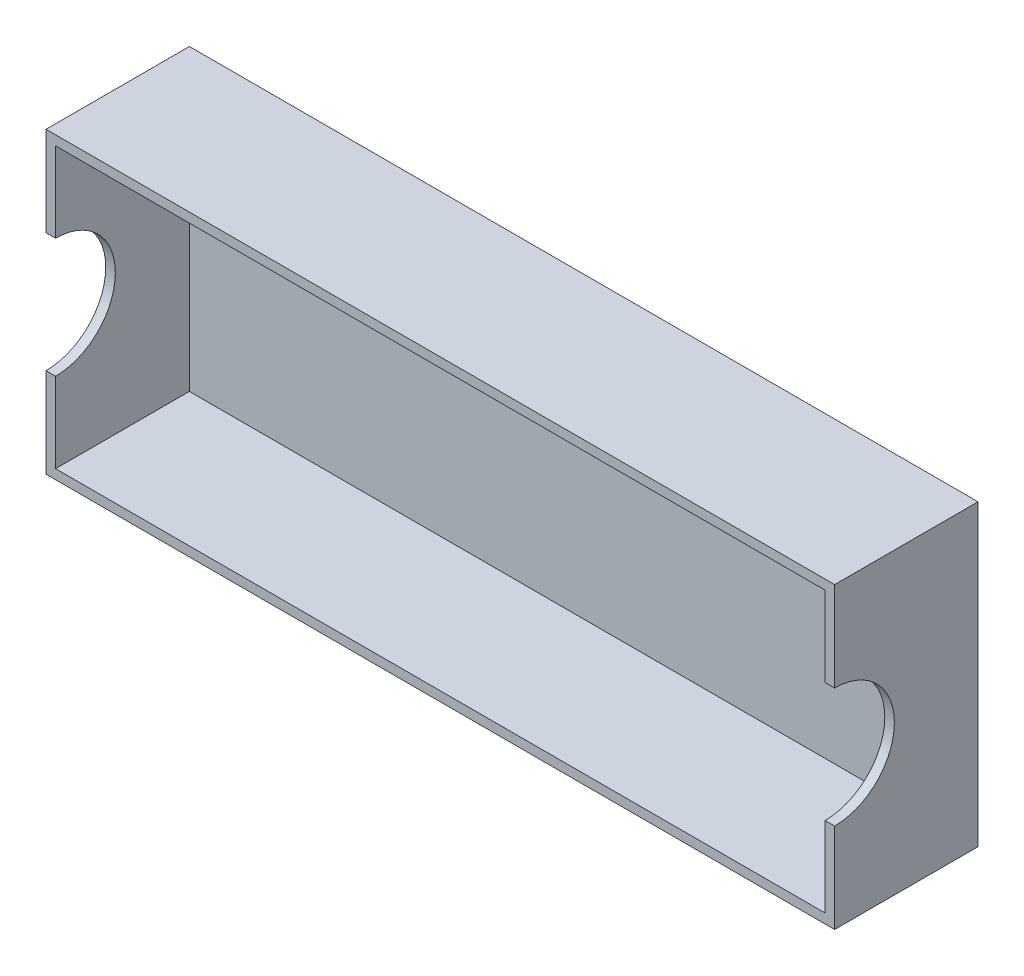
ISO-10303-21;
HEADER;
FILE_DESCRIPTION(('STEP AP214'),'2;1');
FILE_NAME('part.step','',(''),(''),'','','');
FILE_SCHEMA(('AUTOMOTIVE_DESIGN { 1 0 10303 214 1 1 1 1 }'));
ENDSEC;
DATA;
#1=APPLICATION_CONTEXT('core data for automotive mechanical design processes');
#2=APPLICATION_PROTOCOL_DEFINITION('international standard','automotive_design',2000,#1);
#3=PRODUCT_CONTEXT('',#1,'mechanical');
#4=PRODUCT('Part','Part','',(#3));
#5=PRODUCT_RELATED_PRODUCT_CATEGORY('part','',(#4));
#6=PRODUCT_DEFINITION_FORMATION('','',#4);
#7=PRODUCT_DEFINITION_CONTEXT('part definition',#1,'design');
#8=PRODUCT_DEFINITION('design','',#6,#7);
#9=PRODUCT_DEFINITION_SHAPE('','',#8);
#10=(LENGTH_UNIT() NAMED_UNIT(*) SI_UNIT(.MILLI.,.METRE.));
#11=(NAMED_UNIT(*) PLANE_ANGLE_UNIT() SI_UNIT($,.RADIAN.));
#12=(NAMED_UNIT(*) SI_UNIT($,.STERADIAN.) SOLID_ANGLE_UNIT());
#13=UNCERTAINTY_MEASURE_WITH_UNIT(LENGTH_MEASURE(1.E-05),#10,'distance_accuracy_value','');
#14=(GEOMETRIC_REPRESENTATION_CONTEXT(3) GLOBAL_UNCERTAINTY_ASSIGNED_CONTEXT((#13)) GLOBAL_UNIT_ASSIGNED_CONTEXT((#10,
#11,#12)) REPRESENTATION_CONTEXT('',''));
#15=CARTESIAN_POINT('',(0.,0.,0.));
#16=DIRECTION('',(0.,0.,1.));
#17=DIRECTION('',(1.,0.,0.));
#18=AXIS2_PLACEMENT_3D('',#15,#16,#17);
#19=CARTESIAN_POINT('',(0.,0.,12.));
#20=DIRECTION('',(0.,0.,1.));
#21=DIRECTION('',(1.,0.,0.));
#22=AXIS2_PLACEMENT_3D('',#19,#20,#21);
#23=PLANE('',#22);
#24=DIRECTION('',(1.,0.,0.));
#25=VECTOR('',#24,1.);
#26=CARTESIAN_POINT('',(-33.,-5.,12.));
#27=LINE('',#26,#25);
#28=CARTESIAN_POINT('',(-33.,-5.,12.));
#29=VERTEX_POINT('',#28);
#30=CARTESIAN_POINT('',(-32.2,-5.,12.));
#31=VERTEX_POINT('',#30);
#32=EDGE_CURVE('E56',#29,#31,#27,.T.);
#33=ORIENTED_EDGE('',*,*,#32,.F.);
#34=DIRECTION('',(0.,-1.,0.));
#35=VECTOR('',#34,1.);
#36=CARTESIAN_POINT('',(-33.,12.5,12.));
#37=LINE('',#36,#35);
#38=CARTESIAN_POINT('',(-33.,-12.5,12.));
#39=VERTEX_POINT('',#38);
#40=EDGE_CURVE('E135',#29,#39,#37,.T.);
#41=ORIENTED_EDGE('',*,*,#40,.T.);
#42=DIRECTION('',(1.,0.,0.));
#43=VECTOR('',#42,1.);
#44=CARTESIAN_POINT('',(-33.,-12.5,12.));
#45=LINE('',#44,#43);
#46=CARTESIAN_POINT('',(33.,-12.5,12.));
#47=VERTEX_POINT('',#46);
#48=EDGE_CURVE('E142',#39,#47,#45,.T.);
#49=ORIENTED_EDGE('',*,*,#48,.T.);
#50=DIRECTION('',(0.,1.,0.));
#51=VECTOR('',#50,1.);
#52=CARTESIAN_POINT('',(33.,12.5,12.));
#53=LINE('',#52,#51);
#54=CARTESIAN_POINT('',(33.,-5.,12.));
#55=VERTEX_POINT('',#54);
#56=EDGE_CURVE('E185',#47,#55,#53,.T.);
#57=ORIENTED_EDGE('',*,*,#56,.T.);
#58=CARTESIAN_POINT('',(32.2,-5.,12.));
#59=VERTEX_POINT('',#58);
#60=EDGE_CURVE('E191',#59,#55,#27,.T.);
#61=ORIENTED_EDGE('',*,*,#60,.F.);
#62=DIRECTION('',(0.,1.,0.));
#63=VECTOR('',#62,1.);
#64=CARTESIAN_POINT('',(32.2,11.7,12.));
#65=LINE('',#64,#63);
#66=CARTESIAN_POINT('',(32.2,-11.7,12.));
#67=VERTEX_POINT('',#66);
#68=EDGE_CURVE('E195',#67,#59,#65,.T.);
#69=ORIENTED_EDGE('',*,*,#68,.F.);
#70=DIRECTION('',(1.,0.,0.));
#71=VECTOR('',#70,1.);
#72=CARTESIAN_POINT('',(-32.2,-11.7,12.));
#73=LINE('',#72,#71);
#74=CARTESIAN_POINT('',(-32.2,-11.7,12.));
#75=VERTEX_POINT('',#74);
#76=EDGE_CURVE('E212',#75,#67,#73,.T.);
#77=ORIENTED_EDGE('',*,*,#76,.F.);
#78=DIRECTION('',(0.,-1.,0.));
#79=VECTOR('',#78,1.);
#80=CARTESIAN_POINT('',(-32.2,11.7,12.));
#81=LINE('',#80,#79);
#82=EDGE_CURVE('E188',#31,#75,#81,.T.);
#83=ORIENTED_EDGE('',*,*,#82,.F.);
#84=EDGE_LOOP('',(#33,#41,#49,#57,#61,#69,#77,#83));
#85=FACE_BOUND('',#84,.T.);
#86=ADVANCED_FACE('F33',(#85),#23,.T.);
#87=CARTESIAN_POINT('',(33.,12.5,12.));
#88=DIRECTION('',(-1.,0.,0.));
#89=DIRECTION('',(0.,0.,1.));
#90=AXIS2_PLACEMENT_3D('',#87,#88,#89);
#91=PLANE('',#90);
#92=CARTESIAN_POINT('',(33.,5.,12.));
#93=VERTEX_POINT('',#92);
#94=CARTESIAN_POINT('',(33.,12.5,12.));
#95=VERTEX_POINT('',#94);
#96=EDGE_CURVE('E159',#93,#95,#53,.T.);
#97=ORIENTED_EDGE('',*,*,#96,.F.);
#98=CARTESIAN_POINT('',(33.,0.,12.));
#99=DIRECTION('',(1.,0.,0.));
#100=DIRECTION('',(0.,0.,-1.));
#101=AXIS2_PLACEMENT_3D('',#98,#99,#100);
#102=CIRCLE('',#101,5.);
#103=EDGE_CURVE('E136',#55,#93,#102,.T.);
#104=ORIENTED_EDGE('',*,*,#103,.F.);
#105=ORIENTED_EDGE('',*,*,#56,.F.);
#106=DIRECTION('',(0.,0.,-1.));
#107=VECTOR('',#106,1.);
#108=CARTESIAN_POINT('',(33.,-12.5,12.));
#109=LINE('',#108,#107);
#110=CARTESIAN_POINT('',(33.,-12.5,0.));
#111=VERTEX_POINT('',#110);
#112=EDGE_CURVE('E144',#47,#111,#109,.T.);
#113=ORIENTED_EDGE('',*,*,#112,.T.);
#114=DIRECTION('',(0.,1.,0.));
#115=VECTOR('',#114,1.);
#116=CARTESIAN_POINT('',(33.,12.5,0.));
#117=LINE('',#116,#115);
#118=CARTESIAN_POINT('',(33.,12.5,0.));
#119=VERTEX_POINT('',#118);
#120=EDGE_CURVE('E149',#111,#119,#117,.T.);
#121=ORIENTED_EDGE('',*,*,#120,.T.);
#122=DIRECTION('',(0.,0.,-1.));
#123=VECTOR('',#122,1.);
#124=CARTESIAN_POINT('',(33.,12.5,12.));
#125=LINE('',#124,#123);
#126=EDGE_CURVE('E41',#95,#119,#125,.T.);
#127=ORIENTED_EDGE('',*,*,#126,.F.);
#128=EDGE_LOOP('',(#97,#104,#105,#113,#121,#127));
#129=FACE_BOUND('',#128,.T.);
#130=ADVANCED_FACE('F35',(#129),#91,.F.);
#131=CARTESIAN_POINT('',(-33.,12.5,12.));
#132=DIRECTION('',(0.,-1.,0.));
#133=DIRECTION('',(0.,0.,-1.));
#134=AXIS2_PLACEMENT_3D('',#131,#132,#133);
#135=PLANE('',#134);
#136=DIRECTION('',(-1.,0.,0.));
#137=VECTOR('',#136,1.);
#138=CARTESIAN_POINT('',(-33.,12.5,0.));
#139=LINE('',#138,#137);
#140=CARTESIAN_POINT('',(-33.,12.5,0.));
#141=VERTEX_POINT('',#140);
#142=EDGE_CURVE('E152',#119,#141,#139,.T.);
#143=ORIENTED_EDGE('',*,*,#142,.T.);
#144=DIRECTION('',(0.,0.,-1.));
#145=VECTOR('',#144,1.);
#146=CARTESIAN_POINT('',(-33.,12.5,12.));
#147=LINE('',#146,#145);
#148=CARTESIAN_POINT('',(-33.,12.5,12.));
#149=VERTEX_POINT('',#148);
#150=EDGE_CURVE('E165',#149,#141,#147,.T.);
#151=ORIENTED_EDGE('',*,*,#150,.F.);
#152=DIRECTION('',(-1.,0.,0.));
#153=VECTOR('',#152,1.);
#154=CARTESIAN_POINT('',(-33.,12.5,12.));
#155=LINE('',#154,#153);
#156=EDGE_CURVE('E140',#95,#149,#155,.T.);
#157=ORIENTED_EDGE('',*,*,#156,.F.);
#158=ORIENTED_EDGE('',*,*,#126,.T.);
#159=EDGE_LOOP('',(#143,#151,#157,#158));
#160=FACE_BOUND('',#159,.T.);
#161=ADVANCED_FACE('F169',(#160),#135,.F.);
#162=CARTESIAN_POINT('',(-33.,12.5,12.));
#163=DIRECTION('',(1.,0.,0.));
#164=DIRECTION('',(0.,0.,-1.));
#165=AXIS2_PLACEMENT_3D('',#162,#163,#164);
#166=PLANE('',#165);
#167=ORIENTED_EDGE('',*,*,#40,.F.);
#168=CARTESIAN_POINT('',(-33.,0.,12.));
#169=DIRECTION('',(1.,0.,0.));
#170=DIRECTION('',(0.,0.,-1.));
#171=AXIS2_PLACEMENT_3D('',#168,#169,#170);
#172=CIRCLE('',#171,5.);
#173=CARTESIAN_POINT('',(-33.,5.,12.));
#174=VERTEX_POINT('',#173);
#175=EDGE_CURVE('E122',#29,#174,#172,.T.);
#176=ORIENTED_EDGE('',*,*,#175,.T.);
#177=EDGE_CURVE('E133',#149,#174,#37,.T.);
#178=ORIENTED_EDGE('',*,*,#177,.F.);
#179=ORIENTED_EDGE('',*,*,#150,.T.);
#180=DIRECTION('',(0.,-1.,0.));
#181=VECTOR('',#180,1.);
#182=CARTESIAN_POINT('',(-33.,12.5,0.));
#183=LINE('',#182,#181);
#184=CARTESIAN_POINT('',(-33.,-12.5,0.));
#185=VERTEX_POINT('',#184);
#186=EDGE_CURVE('E155',#141,#185,#183,.T.);
#187=ORIENTED_EDGE('',*,*,#186,.T.);
#188=DIRECTION('',(0.,0.,-1.));
#189=VECTOR('',#188,1.);
#190=CARTESIAN_POINT('',(-33.,-12.5,12.));
#191=LINE('',#190,#189);
#192=EDGE_CURVE('E162',#39,#185,#191,.T.);
#193=ORIENTED_EDGE('',*,*,#192,.F.);
#194=EDGE_LOOP('',(#167,#176,#178,#179,#187,#193));
#195=FACE_BOUND('',#194,.T.);
#196=ADVANCED_FACE('F131',(#195),#166,.F.);
#197=CARTESIAN_POINT('',(-33.,-12.5,12.));
#198=DIRECTION('',(0.,1.,0.));
#199=DIRECTION('',(0.,0.,1.));
#200=AXIS2_PLACEMENT_3D('',#197,#198,#199);
#201=PLANE('',#200);
#202=DIRECTION('',(1.,0.,0.));
#203=VECTOR('',#202,1.);
#204=CARTESIAN_POINT('',(-33.,-12.5,0.));
#205=LINE('',#204,#203);
#206=EDGE_CURVE('E157',#185,#111,#205,.T.);
#207=ORIENTED_EDGE('',*,*,#206,.T.);
#208=ORIENTED_EDGE('',*,*,#112,.F.);
#209=ORIENTED_EDGE('',*,*,#48,.F.);
#210=ORIENTED_EDGE('',*,*,#192,.T.);
#211=EDGE_LOOP('',(#207,#208,#209,#210));
#212=FACE_BOUND('',#211,.T.);
#213=ADVANCED_FACE('F181',(#212),#201,.F.);
#214=DIRECTION('',(1.,0.,0.));
#215=VECTOR('',#214,1.);
#216=CARTESIAN_POINT('',(-33.,5.,12.));
#217=LINE('',#216,#215);
#218=CARTESIAN_POINT('',(32.2,5.,12.));
#219=VERTEX_POINT('',#218);
#220=EDGE_CURVE('E48',#93,#219,#217,.F.);
#221=ORIENTED_EDGE('',*,*,#220,.F.);
#222=ORIENTED_EDGE('',*,*,#96,.T.);
#223=ORIENTED_EDGE('',*,*,#156,.T.);
#224=ORIENTED_EDGE('',*,*,#177,.T.);
#225=CARTESIAN_POINT('',(-32.2,5.,12.));
#226=VERTEX_POINT('',#225);
#227=EDGE_CURVE('E119',#226,#174,#217,.F.);
#228=ORIENTED_EDGE('',*,*,#227,.F.);
#229=CARTESIAN_POINT('',(-32.2,11.7,12.));
#230=VERTEX_POINT('',#229);
#231=EDGE_CURVE('E216',#230,#226,#81,.T.);
#232=ORIENTED_EDGE('',*,*,#231,.F.);
#233=DIRECTION('',(-1.,0.,0.));
#234=VECTOR('',#233,1.);
#235=CARTESIAN_POINT('',(-32.2,11.7,12.));
#236=LINE('',#235,#234);
#237=CARTESIAN_POINT('',(32.2,11.7,12.));
#238=VERTEX_POINT('',#237);
#239=EDGE_CURVE('E218',#238,#230,#236,.T.);
#240=ORIENTED_EDGE('',*,*,#239,.F.);
#241=EDGE_CURVE('E193',#219,#238,#65,.T.);
#242=ORIENTED_EDGE('',*,*,#241,.F.);
#243=EDGE_LOOP('',(#221,#222,#223,#224,#228,#232,#240,#242));
#244=FACE_BOUND('',#243,.T.);
#245=ADVANCED_FACE('F138',(#244),#23,.T.);
#246=CARTESIAN_POINT('',(0.,0.,0.));
#247=DIRECTION('',(0.,0.,1.));
#248=DIRECTION('',(1.,0.,0.));
#249=AXIS2_PLACEMENT_3D('',#246,#247,#248);
#250=PLANE('',#249);
#251=ORIENTED_EDGE('',*,*,#120,.F.);
#252=ORIENTED_EDGE('',*,*,#206,.F.);
#253=ORIENTED_EDGE('',*,*,#186,.F.);
#254=ORIENTED_EDGE('',*,*,#142,.F.);
#255=EDGE_LOOP('',(#251,#252,#253,#254));
#256=FACE_BOUND('',#255,.T.);
#257=ADVANCED_FACE('F177',(#256),#250,.F.);
#258=CARTESIAN_POINT('',(32.2,11.7,0.8));
#259=DIRECTION('',(1.,0.,0.));
#260=DIRECTION('',(0.,0.,-1.));
#261=AXIS2_PLACEMENT_3D('',#258,#259,#260);
#262=PLANE('',#261);
#263=ORIENTED_EDGE('',*,*,#68,.T.);
#264=CARTESIAN_POINT('',(32.2,0.,12.));
#265=DIRECTION('',(1.,0.,0.));
#266=DIRECTION('',(0.,0.,-1.));
#267=AXIS2_PLACEMENT_3D('',#264,#265,#266);
#268=CIRCLE('',#267,5.);
#269=EDGE_CURVE('E189',#59,#219,#268,.T.);
#270=ORIENTED_EDGE('',*,*,#269,.T.);
#271=ORIENTED_EDGE('',*,*,#241,.T.);
#272=DIRECTION('',(0.,0.,1.));
#273=VECTOR('',#272,1.);
#274=CARTESIAN_POINT('',(32.2,11.7,0.8));
#275=LINE('',#274,#273);
#276=CARTESIAN_POINT('',(32.2,11.7,0.8));
#277=VERTEX_POINT('',#276);
#278=EDGE_CURVE('E202',#277,#238,#275,.T.);
#279=ORIENTED_EDGE('',*,*,#278,.F.);
#280=DIRECTION('',(0.,1.,0.));
#281=VECTOR('',#280,1.);
#282=CARTESIAN_POINT('',(32.2,11.7,0.8));
#283=LINE('',#282,#281);
#284=CARTESIAN_POINT('',(32.2,-11.7,0.8));
#285=VERTEX_POINT('',#284);
#286=EDGE_CURVE('E215',#285,#277,#283,.T.);
#287=ORIENTED_EDGE('',*,*,#286,.F.);
#288=DIRECTION('',(0.,0.,1.));
#289=VECTOR('',#288,1.);
#290=CARTESIAN_POINT('',(32.2,-11.7,0.8));
#291=LINE('',#290,#289);
#292=EDGE_CURVE('E153',#285,#67,#291,.T.);
#293=ORIENTED_EDGE('',*,*,#292,.T.);
#294=EDGE_LOOP('',(#263,#270,#271,#279,#287,#293));
#295=FACE_BOUND('',#294,.T.);
#296=ADVANCED_FACE('F237',(#295),#262,.F.);
#297=CARTESIAN_POINT('',(-32.2,-11.7,0.8));
#298=DIRECTION('',(0.,-1.,0.));
#299=DIRECTION('',(0.,0.,-1.));
#300=AXIS2_PLACEMENT_3D('',#297,#298,#299);
#301=PLANE('',#300);
#302=ORIENTED_EDGE('',*,*,#76,.T.);
#303=ORIENTED_EDGE('',*,*,#292,.F.);
#304=DIRECTION('',(1.,0.,0.));
#305=VECTOR('',#304,1.);
#306=CARTESIAN_POINT('',(-32.2,-11.7,0.8));
#307=LINE('',#306,#305);
#308=CARTESIAN_POINT('',(-32.2,-11.7,0.8));
#309=VERTEX_POINT('',#308);
#310=EDGE_CURVE('E206',#309,#285,#307,.T.);
#311=ORIENTED_EDGE('',*,*,#310,.F.);
#312=DIRECTION('',(0.,0.,1.));
#313=VECTOR('',#312,1.);
#314=CARTESIAN_POINT('',(-32.2,-11.7,0.8));
#315=LINE('',#314,#313);
#316=EDGE_CURVE('E208',#309,#75,#315,.T.);
#317=ORIENTED_EDGE('',*,*,#316,.T.);
#318=EDGE_LOOP('',(#302,#303,#311,#317));
#319=FACE_BOUND('',#318,.T.);
#320=ADVANCED_FACE('F244',(#319),#301,.F.);
#321=CARTESIAN_POINT('',(-32.2,11.7,0.8));
#322=DIRECTION('',(-1.,0.,0.));
#323=DIRECTION('',(0.,0.,1.));
#324=AXIS2_PLACEMENT_3D('',#321,#322,#323);
#325=PLANE('',#324);
#326=ORIENTED_EDGE('',*,*,#231,.T.);
#327=CARTESIAN_POINT('',(-32.2,0.,12.));
#328=DIRECTION('',(-1.,0.,0.));
#329=DIRECTION('',(0.,0.,1.));
#330=AXIS2_PLACEMENT_3D('',#327,#328,#329);
#331=CIRCLE('',#330,5.);
#332=EDGE_CURVE('E11',#226,#31,#331,.T.);
#333=ORIENTED_EDGE('',*,*,#332,.T.);
#334=ORIENTED_EDGE('',*,*,#82,.T.);
#335=ORIENTED_EDGE('',*,*,#316,.F.);
#336=DIRECTION('',(0.,-1.,0.));
#337=VECTOR('',#336,1.);
#338=CARTESIAN_POINT('',(-32.2,11.7,0.8));
#339=LINE('',#338,#337);
#340=CARTESIAN_POINT('',(-32.2,11.7,0.8));
#341=VERTEX_POINT('',#340);
#342=EDGE_CURVE('E224',#341,#309,#339,.T.);
#343=ORIENTED_EDGE('',*,*,#342,.F.);
#344=DIRECTION('',(0.,0.,1.));
#345=VECTOR('',#344,1.);
#346=CARTESIAN_POINT('',(-32.2,11.7,0.8));
#347=LINE('',#346,#345);
#348=EDGE_CURVE('E205',#341,#230,#347,.T.);
#349=ORIENTED_EDGE('',*,*,#348,.T.);
#350=EDGE_LOOP('',(#326,#333,#334,#335,#343,#349));
#351=FACE_BOUND('',#350,.T.);
#352=ADVANCED_FACE('F242',(#351),#325,.F.);
#353=CARTESIAN_POINT('',(-32.2,11.7,0.8));
#354=DIRECTION('',(0.,1.,0.));
#355=DIRECTION('',(0.,0.,1.));
#356=AXIS2_PLACEMENT_3D('',#353,#354,#355);
#357=PLANE('',#356);
#358=ORIENTED_EDGE('',*,*,#239,.T.);
#359=ORIENTED_EDGE('',*,*,#348,.F.);
#360=DIRECTION('',(-1.,0.,0.));
#361=VECTOR('',#360,1.);
#362=CARTESIAN_POINT('',(-32.2,11.7,0.8));
#363=LINE('',#362,#361);
#364=EDGE_CURVE('E227',#277,#341,#363,.T.);
#365=ORIENTED_EDGE('',*,*,#364,.F.);
#366=ORIENTED_EDGE('',*,*,#278,.T.);
#367=EDGE_LOOP('',(#358,#359,#365,#366));
#368=FACE_BOUND('',#367,.T.);
#369=ADVANCED_FACE('F239',(#368),#357,.F.);
#370=CARTESIAN_POINT('',(0.,0.,0.8));
#371=DIRECTION('',(0.,0.,1.));
#372=DIRECTION('',(1.,0.,0.));
#373=AXIS2_PLACEMENT_3D('',#370,#371,#372);
#374=PLANE('',#373);
#375=ORIENTED_EDGE('',*,*,#286,.T.);
#376=ORIENTED_EDGE('',*,*,#364,.T.);
#377=ORIENTED_EDGE('',*,*,#342,.T.);
#378=ORIENTED_EDGE('',*,*,#310,.T.);
#379=EDGE_LOOP('',(#375,#376,#377,#378));
#380=FACE_BOUND('',#379,.T.);
#381=ADVANCED_FACE('F233',(#380),#374,.T.);
#382=CARTESIAN_POINT('',(-33.,0.,12.));
#383=DIRECTION('',(1.,0.,0.));
#384=DIRECTION('',(0.,0.,-1.));
#385=AXIS2_PLACEMENT_3D('',#382,#383,#384);
#386=CYLINDRICAL_SURFACE('',#385,5.);
#387=ORIENTED_EDGE('',*,*,#32,.T.);
#388=ORIENTED_EDGE('',*,*,#332,.F.);
#389=ORIENTED_EDGE('',*,*,#227,.T.);
#390=ORIENTED_EDGE('',*,*,#175,.F.);
#391=EDGE_LOOP('',(#387,#388,#389,#390));
#392=FACE_BOUND('',#391,.T.);
#393=ADVANCED_FACE('F121',(#392),#386,.F.);
#394=ORIENTED_EDGE('',*,*,#60,.T.);
#395=ORIENTED_EDGE('',*,*,#103,.T.);
#396=ORIENTED_EDGE('',*,*,#220,.T.);
#397=ORIENTED_EDGE('',*,*,#269,.F.);
#398=EDGE_LOOP('',(#394,#395,#396,#397));
#399=FACE_BOUND('',#398,.T.);
#400=ADVANCED_FACE('F198',(#399),#386,.F.);
#401=CLOSED_SHELL('',(#86,#130,#161,#196,#213,#245,#257,#296,#320,#352,#369,#381,#393,#400));
#402=MANIFOLD_SOLID_BREP('B2',#401);
#403=ADVANCED_BREP_SHAPE_REPRESENTATION('',(#18,#402),#14);
#404=SHAPE_DEFINITION_REPRESENTATION(#9,#403);
ENDSEC;
END-ISO-10303-21;
